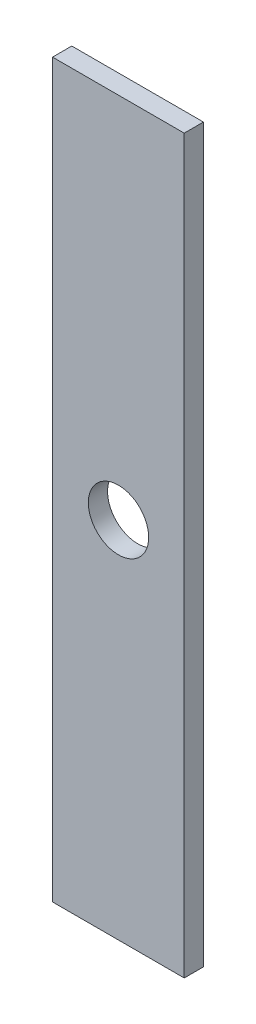
ISO-10303-21;
HEADER;
FILE_DESCRIPTION(('STEP AP214'),'2;1');
FILE_NAME('part.step','',(''),(''),'','','');
FILE_SCHEMA(('AUTOMOTIVE_DESIGN { 1 0 10303 214 1 1 1 1 }'));
ENDSEC;
DATA;
#1=APPLICATION_CONTEXT('core data for automotive mechanical design processes');
#2=APPLICATION_PROTOCOL_DEFINITION('international standard','automotive_design',2000,#1);
#3=PRODUCT_CONTEXT('',#1,'mechanical');
#4=PRODUCT('Part','Part','',(#3));
#5=PRODUCT_RELATED_PRODUCT_CATEGORY('part','',(#4));
#6=PRODUCT_DEFINITION_FORMATION('','',#4);
#7=PRODUCT_DEFINITION_CONTEXT('part definition',#1,'design');
#8=PRODUCT_DEFINITION('design','',#6,#7);
#9=PRODUCT_DEFINITION_SHAPE('','',#8);
#10=(LENGTH_UNIT() NAMED_UNIT(*) SI_UNIT(.MILLI.,.METRE.));
#11=(NAMED_UNIT(*) PLANE_ANGLE_UNIT() SI_UNIT($,.RADIAN.));
#12=(NAMED_UNIT(*) SI_UNIT($,.STERADIAN.) SOLID_ANGLE_UNIT());
#13=UNCERTAINTY_MEASURE_WITH_UNIT(LENGTH_MEASURE(1.E-05),#10,'distance_accuracy_value','');
#14=(GEOMETRIC_REPRESENTATION_CONTEXT(3) GLOBAL_UNCERTAINTY_ASSIGNED_CONTEXT((#13)) GLOBAL_UNIT_ASSIGNED_CONTEXT((#10,
#11,#12)) REPRESENTATION_CONTEXT('',''));
#15=CARTESIAN_POINT('',(0.,0.,0.));
#16=DIRECTION('',(0.,0.,1.));
#17=DIRECTION('',(1.,0.,0.));
#18=AXIS2_PLACEMENT_3D('',#15,#16,#17);
#19=CARTESIAN_POINT('',(-38.1,-211.709,11.1252));
#20=DIRECTION('',(1.,0.,0.));
#21=DIRECTION('',(0.,0.,-1.));
#22=AXIS2_PLACEMENT_3D('',#19,#20,#21);
#23=PLANE('',#22);
#24=DIRECTION('',(0.,-1.,0.));
#25=VECTOR('',#24,1.);
#26=CARTESIAN_POINT('',(-38.1,-211.709,0.));
#27=LINE('',#26,#25);
#28=CARTESIAN_POINT('',(-38.1,211.709,0.));
#29=VERTEX_POINT('',#28);
#30=CARTESIAN_POINT('',(-38.1,-211.709,0.));
#31=VERTEX_POINT('',#30);
#32=EDGE_CURVE('E98',#29,#31,#27,.T.);
#33=ORIENTED_EDGE('',*,*,#32,.T.);
#34=DIRECTION('',(0.,0.,-1.));
#35=VECTOR('',#34,1.);
#36=CARTESIAN_POINT('',(-38.1,-211.709,11.1252));
#37=LINE('',#36,#35);
#38=CARTESIAN_POINT('',(-38.1,-211.709,11.1252));
#39=VERTEX_POINT('',#38);
#40=EDGE_CURVE('E11',#39,#31,#37,.T.);
#41=ORIENTED_EDGE('',*,*,#40,.F.);
#42=DIRECTION('',(0.,-1.,0.));
#43=VECTOR('',#42,1.);
#44=CARTESIAN_POINT('',(-38.1,-211.709,11.1252));
#45=LINE('',#44,#43);
#46=CARTESIAN_POINT('',(-38.1,211.709,11.1252));
#47=VERTEX_POINT('',#46);
#48=EDGE_CURVE('E86',#47,#39,#45,.T.);
#49=ORIENTED_EDGE('',*,*,#48,.F.);
#50=DIRECTION('',(0.,0.,-1.));
#51=VECTOR('',#50,1.);
#52=CARTESIAN_POINT('',(-38.1,211.709,11.1252));
#53=LINE('',#52,#51);
#54=EDGE_CURVE('E94',#47,#29,#53,.T.);
#55=ORIENTED_EDGE('',*,*,#54,.T.);
#56=EDGE_LOOP('',(#33,#41,#49,#55));
#57=FACE_BOUND('',#56,.T.);
#58=ADVANCED_FACE('F35',(#57),#23,.F.);
#59=CARTESIAN_POINT('',(38.1,-211.709,11.1252));
#60=DIRECTION('',(0.,1.,0.));
#61=DIRECTION('',(0.,0.,1.));
#62=AXIS2_PLACEMENT_3D('',#59,#60,#61);
#63=PLANE('',#62);
#64=DIRECTION('',(1.,0.,0.));
#65=VECTOR('',#64,1.);
#66=CARTESIAN_POINT('',(38.1,-211.709,0.));
#67=LINE('',#66,#65);
#68=CARTESIAN_POINT('',(38.1,-211.709,0.));
#69=VERTEX_POINT('',#68);
#70=EDGE_CURVE('E90',#31,#69,#67,.T.);
#71=ORIENTED_EDGE('',*,*,#70,.T.);
#72=DIRECTION('',(0.,0.,-1.));
#73=VECTOR('',#72,1.);
#74=CARTESIAN_POINT('',(38.1,-211.709,11.1252));
#75=LINE('',#74,#73);
#76=CARTESIAN_POINT('',(38.1,-211.709,11.1252));
#77=VERTEX_POINT('',#76);
#78=EDGE_CURVE('E43',#77,#69,#75,.T.);
#79=ORIENTED_EDGE('',*,*,#78,.F.);
#80=DIRECTION('',(1.,0.,0.));
#81=VECTOR('',#80,1.);
#82=CARTESIAN_POINT('',(38.1,-211.709,11.1252));
#83=LINE('',#82,#81);
#84=EDGE_CURVE('E81',#39,#77,#83,.T.);
#85=ORIENTED_EDGE('',*,*,#84,.F.);
#86=ORIENTED_EDGE('',*,*,#40,.T.);
#87=EDGE_LOOP('',(#71,#79,#85,#86));
#88=FACE_BOUND('',#87,.T.);
#89=ADVANCED_FACE('F89',(#88),#63,.F.);
#90=CARTESIAN_POINT('',(38.1,-211.709,11.1252));
#91=DIRECTION('',(-1.,0.,0.));
#92=DIRECTION('',(0.,0.,1.));
#93=AXIS2_PLACEMENT_3D('',#90,#91,#92);
#94=PLANE('',#93);
#95=DIRECTION('',(0.,1.,0.));
#96=VECTOR('',#95,1.);
#97=CARTESIAN_POINT('',(38.1,-211.709,0.));
#98=LINE('',#97,#96);
#99=CARTESIAN_POINT('',(38.1,211.709,0.));
#100=VERTEX_POINT('',#99);
#101=EDGE_CURVE('E68',#69,#100,#98,.T.);
#102=ORIENTED_EDGE('',*,*,#101,.T.);
#103=DIRECTION('',(0.,0.,-1.));
#104=VECTOR('',#103,1.);
#105=CARTESIAN_POINT('',(38.1,211.709,11.1252));
#106=LINE('',#105,#104);
#107=CARTESIAN_POINT('',(38.1,211.709,11.1252));
#108=VERTEX_POINT('',#107);
#109=EDGE_CURVE('E91',#108,#100,#106,.T.);
#110=ORIENTED_EDGE('',*,*,#109,.F.);
#111=DIRECTION('',(0.,1.,0.));
#112=VECTOR('',#111,1.);
#113=CARTESIAN_POINT('',(38.1,-211.709,11.1252));
#114=LINE('',#113,#112);
#115=EDGE_CURVE('E84',#77,#108,#114,.T.);
#116=ORIENTED_EDGE('',*,*,#115,.F.);
#117=ORIENTED_EDGE('',*,*,#78,.T.);
#118=EDGE_LOOP('',(#102,#110,#116,#117));
#119=FACE_BOUND('',#118,.T.);
#120=ADVANCED_FACE('F92',(#119),#94,.F.);
#121=CARTESIAN_POINT('',(38.1,211.709,11.1252));
#122=DIRECTION('',(0.,-1.,0.));
#123=DIRECTION('',(0.,0.,-1.));
#124=AXIS2_PLACEMENT_3D('',#121,#122,#123);
#125=PLANE('',#124);
#126=DIRECTION('',(-1.,0.,0.));
#127=VECTOR('',#126,1.);
#128=CARTESIAN_POINT('',(38.1,211.709,0.));
#129=LINE('',#128,#127);
#130=EDGE_CURVE('E74',#100,#29,#129,.T.);
#131=ORIENTED_EDGE('',*,*,#130,.T.);
#132=ORIENTED_EDGE('',*,*,#54,.F.);
#133=DIRECTION('',(-1.,0.,0.));
#134=VECTOR('',#133,1.);
#135=CARTESIAN_POINT('',(38.1,211.709,11.1252));
#136=LINE('',#135,#134);
#137=EDGE_CURVE('E51',#108,#47,#136,.T.);
#138=ORIENTED_EDGE('',*,*,#137,.F.);
#139=ORIENTED_EDGE('',*,*,#109,.T.);
#140=EDGE_LOOP('',(#131,#132,#138,#139));
#141=FACE_BOUND('',#140,.T.);
#142=ADVANCED_FACE('F106',(#141),#125,.F.);
#143=CARTESIAN_POINT('',(0.,0.,11.1252));
#144=DIRECTION('',(0.,0.,1.));
#145=DIRECTION('',(1.,0.,0.));
#146=AXIS2_PLACEMENT_3D('',#143,#144,#145);
#147=PLANE('',#146);
#148=CARTESIAN_POINT('',(0.0634999999999872,-1.2065,11.1252));
#149=DIRECTION('',(0.,0.,1.));
#150=DIRECTION('',(1.,0.,0.));
#151=AXIS2_PLACEMENT_3D('',#148,#149,#150);
#152=CIRCLE('',#151,17.4625);
#153=CARTESIAN_POINT('',(17.526,-1.2065,11.1252));
#154=VERTEX_POINT('',#153);
#155=EDGE_CURVE('E112',#154,#154,#152,.T.);
#156=ORIENTED_EDGE('',*,*,#155,.F.);
#157=EDGE_LOOP('',(#156));
#158=FACE_BOUND('',#157,.T.);
#159=ORIENTED_EDGE('',*,*,#48,.T.);
#160=ORIENTED_EDGE('',*,*,#84,.T.);
#161=ORIENTED_EDGE('',*,*,#115,.T.);
#162=ORIENTED_EDGE('',*,*,#137,.T.);
#163=EDGE_LOOP('',(#159,#160,#161,#162));
#164=FACE_BOUND('',#163,.T.);
#165=ADVANCED_FACE('F82',(#158,#164),#147,.T.);
#166=CARTESIAN_POINT('',(0.,0.,0.));
#167=DIRECTION('',(0.,0.,1.));
#168=DIRECTION('',(1.,0.,0.));
#169=AXIS2_PLACEMENT_3D('',#166,#167,#168);
#170=PLANE('',#169);
#171=CARTESIAN_POINT('',(0.0634999999999872,-1.2065,0.));
#172=DIRECTION('',(0.,0.,1.));
#173=DIRECTION('',(1.,0.,0.));
#174=AXIS2_PLACEMENT_3D('',#171,#172,#173);
#175=CIRCLE('',#174,17.4625);
#176=CARTESIAN_POINT('',(17.526,-1.2065,0.));
#177=VERTEX_POINT('',#176);
#178=EDGE_CURVE('E101',#177,#177,#175,.T.);
#179=ORIENTED_EDGE('',*,*,#178,.T.);
#180=EDGE_LOOP('',(#179));
#181=FACE_BOUND('',#180,.T.);
#182=ORIENTED_EDGE('',*,*,#32,.F.);
#183=ORIENTED_EDGE('',*,*,#130,.F.);
#184=ORIENTED_EDGE('',*,*,#101,.F.);
#185=ORIENTED_EDGE('',*,*,#70,.F.);
#186=EDGE_LOOP('',(#182,#183,#184,#185));
#187=FACE_BOUND('',#186,.T.);
#188=ADVANCED_FACE('F109',(#181,#187),#170,.F.);
#189=CARTESIAN_POINT('',(0.0634999999999872,-1.2065,0.));
#190=DIRECTION('',(0.,0.,1.));
#191=DIRECTION('',(1.,0.,0.));
#192=AXIS2_PLACEMENT_3D('',#189,#190,#191);
#193=CYLINDRICAL_SURFACE('',#192,17.4625);
#194=CARTESIAN_POINT('',(17.526,-1.2065,0.));
#195=CARTESIAN_POINT('',(17.526,-1.2065,0.1158875));
#196=CARTESIAN_POINT('',(17.526,-1.2065,0.231775));
#197=CARTESIAN_POINT('',(17.526,-1.2065,0.46355));
#198=CARTESIAN_POINT('',(17.526,-1.2065,0.5794375));
#199=CARTESIAN_POINT('',(17.526,-1.2065,0.8112125));
#200=CARTESIAN_POINT('',(17.526,-1.2065,0.9271));
#201=CARTESIAN_POINT('',(17.526,-1.2065,1.158875));
#202=CARTESIAN_POINT('',(17.526,-1.2065,1.2747625));
#203=CARTESIAN_POINT('',(17.526,-1.2065,1.5065375));
#204=CARTESIAN_POINT('',(17.526,-1.2065,1.622425));
#205=CARTESIAN_POINT('',(17.526,-1.2065,1.8542));
#206=CARTESIAN_POINT('',(17.526,-1.2065,1.9700875));
#207=CARTESIAN_POINT('',(17.526,-1.2065,2.2018625));
#208=CARTESIAN_POINT('',(17.526,-1.2065,2.31775));
#209=CARTESIAN_POINT('',(17.526,-1.2065,2.549525));
#210=CARTESIAN_POINT('',(17.526,-1.2065,2.6654125));
#211=CARTESIAN_POINT('',(17.526,-1.2065,2.8971875));
#212=CARTESIAN_POINT('',(17.526,-1.2065,3.013075));
#213=CARTESIAN_POINT('',(17.526,-1.2065,3.24485));
#214=CARTESIAN_POINT('',(17.526,-1.2065,3.3607375));
#215=CARTESIAN_POINT('',(17.526,-1.2065,3.5925125));
#216=CARTESIAN_POINT('',(17.526,-1.2065,3.7084));
#217=CARTESIAN_POINT('',(17.526,-1.2065,3.940175));
#218=CARTESIAN_POINT('',(17.526,-1.2065,4.0560625));
#219=CARTESIAN_POINT('',(17.526,-1.2065,4.2878375));
#220=CARTESIAN_POINT('',(17.526,-1.2065,4.403725));
#221=CARTESIAN_POINT('',(17.526,-1.2065,4.6355));
#222=CARTESIAN_POINT('',(17.526,-1.2065,4.7513875));
#223=CARTESIAN_POINT('',(17.526,-1.2065,4.9831625));
#224=CARTESIAN_POINT('',(17.526,-1.2065,5.09905));
#225=CARTESIAN_POINT('',(17.526,-1.2065,5.330825));
#226=CARTESIAN_POINT('',(17.526,-1.2065,5.4467125));
#227=CARTESIAN_POINT('',(17.526,-1.2065,5.6784875));
#228=CARTESIAN_POINT('',(17.526,-1.2065,5.794375));
#229=CARTESIAN_POINT('',(17.526,-1.2065,6.02615));
#230=CARTESIAN_POINT('',(17.526,-1.2065,6.1420375));
#231=CARTESIAN_POINT('',(17.526,-1.2065,6.3738125));
#232=CARTESIAN_POINT('',(17.526,-1.2065,6.4897));
#233=CARTESIAN_POINT('',(17.526,-1.2065,6.721475));
#234=CARTESIAN_POINT('',(17.526,-1.2065,6.8373625));
#235=CARTESIAN_POINT('',(17.526,-1.2065,7.0691375));
#236=CARTESIAN_POINT('',(17.526,-1.2065,7.185025));
#237=CARTESIAN_POINT('',(17.526,-1.2065,7.4168));
#238=CARTESIAN_POINT('',(17.526,-1.2065,7.5326875));
#239=CARTESIAN_POINT('',(17.526,-1.2065,7.7644625));
#240=CARTESIAN_POINT('',(17.526,-1.2065,7.88035));
#241=CARTESIAN_POINT('',(17.526,-1.2065,8.112125));
#242=CARTESIAN_POINT('',(17.526,-1.2065,8.2280125));
#243=CARTESIAN_POINT('',(17.526,-1.2065,8.4597875));
#244=CARTESIAN_POINT('',(17.526,-1.2065,8.575675));
#245=CARTESIAN_POINT('',(17.526,-1.2065,8.80745));
#246=CARTESIAN_POINT('',(17.526,-1.2065,8.9233375));
#247=CARTESIAN_POINT('',(17.526,-1.2065,9.1551125));
#248=CARTESIAN_POINT('',(17.526,-1.2065,9.271));
#249=CARTESIAN_POINT('',(17.526,-1.2065,9.502775));
#250=CARTESIAN_POINT('',(17.526,-1.2065,9.6186625));
#251=CARTESIAN_POINT('',(17.526,-1.2065,9.8504375));
#252=CARTESIAN_POINT('',(17.526,-1.2065,9.966325));
#253=CARTESIAN_POINT('',(17.526,-1.2065,10.1981));
#254=CARTESIAN_POINT('',(17.526,-1.2065,10.3139875));
#255=CARTESIAN_POINT('',(17.526,-1.2065,10.5457625));
#256=CARTESIAN_POINT('',(17.526,-1.2065,10.66165));
#257=CARTESIAN_POINT('',(17.526,-1.2065,10.893425));
#258=CARTESIAN_POINT('',(17.526,-1.2065,11.0093125));
#259=CARTESIAN_POINT('',(17.526,-1.2065,11.1252));
#260=B_SPLINE_CURVE_WITH_KNOTS('',3,(#194,#195,#196,#197,#198,#199,#200,#201,#202,#203,#204,
#205,#206,#207,#208,#209,#210,#211,#212,#213,#214,#215,#216,#217,#218,#219,#220,#221,#222,#223,
#224,#225,#226,#227,#228,#229,#230,#231,#232,#233,#234,#235,#236,#237,#238,#239,#240,#241,#242,
#243,#244,#245,#246,#247,#248,#249,#250,#251,#252,#253,#254,#255,#256,#257,#258,#259),
.UNSPECIFIED.,.F.,.F.,(4,2,2,2,2,2,2,2,2,2,2,2,2,2,2,2,2,2,2,2,2,2,2,2,2,2,2,2,2,2,2,2,4),(0.,
0.3476625,0.695325,1.0429875,1.39065,1.7383125,2.085975,2.4336375,2.7813,3.1289625,3.476625,
3.8242875,4.17195,4.5196125,4.867275,5.2149375,5.5626,5.9102625,6.257925,6.6055875,6.95325,
7.3009125,7.648575,7.9962375,8.3439,8.6915625,9.039225,9.3868875,9.73455,10.0822125,10.429875,
10.7775375,11.1252),.UNSPECIFIED.);
#261=EDGE_CURVE('BSEAM119',#177,#154,#260,.T.);
#262=ORIENTED_EDGE('',*,*,#178,.F.);
#263=ORIENTED_EDGE('',*,*,#155,.T.);
#264=ORIENTED_EDGE('',*,*,#261,.T.);
#265=ORIENTED_EDGE('',*,*,#261,.F.);
#266=EDGE_LOOP('',(#262,#264,#263,#265));
#267=FACE_BOUND('',#266,.T.);
#268=ADVANCED_FACE('F119',(#267),#193,.F.);
#269=CLOSED_SHELL('',(#58,#89,#120,#142,#165,#188,#268));
#270=MANIFOLD_SOLID_BREP('B2',#269);
#271=ADVANCED_BREP_SHAPE_REPRESENTATION('',(#18,#270),#14);
#272=SHAPE_DEFINITION_REPRESENTATION(#9,#271);
ENDSEC;
END-ISO-10303-21;
